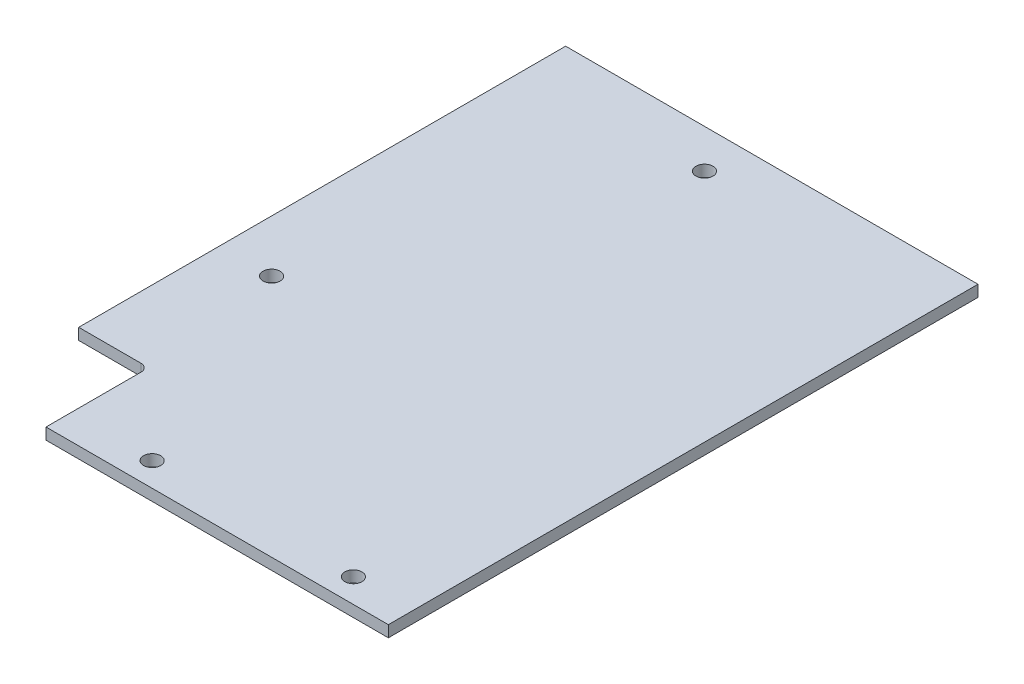
ISO-10303-21;
HEADER;
FILE_DESCRIPTION(('STEP AP214'),'2;1');
FILE_NAME('part.step','',(''),(''),'','','');
FILE_SCHEMA(('AUTOMOTIVE_DESIGN { 1 0 10303 214 1 1 1 1 }'));
ENDSEC;
DATA;
#1=APPLICATION_CONTEXT('core data for automotive mechanical design processes');
#2=APPLICATION_PROTOCOL_DEFINITION('international standard','automotive_design',2000,#1);
#3=PRODUCT_CONTEXT('',#1,'mechanical');
#4=PRODUCT('Part','Part','',(#3));
#5=PRODUCT_RELATED_PRODUCT_CATEGORY('part','',(#4));
#6=PRODUCT_DEFINITION_FORMATION('','',#4);
#7=PRODUCT_DEFINITION_CONTEXT('part definition',#1,'design');
#8=PRODUCT_DEFINITION('design','',#6,#7);
#9=PRODUCT_DEFINITION_SHAPE('','',#8);
#10=(LENGTH_UNIT() NAMED_UNIT(*) SI_UNIT(.MILLI.,.METRE.));
#11=(NAMED_UNIT(*) PLANE_ANGLE_UNIT() SI_UNIT($,.RADIAN.));
#12=(NAMED_UNIT(*) SI_UNIT($,.STERADIAN.) SOLID_ANGLE_UNIT());
#13=UNCERTAINTY_MEASURE_WITH_UNIT(LENGTH_MEASURE(1.E-05),#10,'distance_accuracy_value','');
#14=(GEOMETRIC_REPRESENTATION_CONTEXT(3) GLOBAL_UNCERTAINTY_ASSIGNED_CONTEXT((#13)) GLOBAL_UNIT_ASSIGNED_CONTEXT((#10,
#11,#12)) REPRESENTATION_CONTEXT('',''));
#15=CARTESIAN_POINT('',(0.,0.,0.));
#16=DIRECTION('',(0.,0.,1.));
#17=DIRECTION('',(1.,0.,0.));
#18=AXIS2_PLACEMENT_3D('',#15,#16,#17);
#19=CARTESIAN_POINT('',(-108.4,3.,0.));
#20=DIRECTION('',(0.,0.,1.));
#21=DIRECTION('',(1.,0.,0.));
#22=AXIS2_PLACEMENT_3D('',#19,#20,#21);
#23=PLANE('',#22);
#24=DIRECTION('',(-1.,0.,0.));
#25=VECTOR('',#24,1.);
#26=CARTESIAN_POINT('',(-108.4,0.,0.));
#27=LINE('',#26,#25);
#28=CARTESIAN_POINT('',(0.,0.,0.));
#29=VERTEX_POINT('',#28);
#30=CARTESIAN_POINT('',(-108.4,0.,0.));
#31=VERTEX_POINT('',#30);
#32=EDGE_CURVE('E123',#29,#31,#27,.T.);
#33=ORIENTED_EDGE('',*,*,#32,.T.);
#34=DIRECTION('',(0.,-1.,0.));
#35=VECTOR('',#34,1.);
#36=CARTESIAN_POINT('',(-108.4,3.,0.));
#37=LINE('',#36,#35);
#38=CARTESIAN_POINT('',(-108.4,3.,0.));
#39=VERTEX_POINT('',#38);
#40=EDGE_CURVE('E103',#39,#31,#37,.T.);
#41=ORIENTED_EDGE('',*,*,#40,.F.);
#42=DIRECTION('',(-1.,0.,0.));
#43=VECTOR('',#42,1.);
#44=CARTESIAN_POINT('',(-108.4,3.,0.));
#45=LINE('',#44,#43);
#46=CARTESIAN_POINT('',(0.,3.,0.));
#47=VERTEX_POINT('',#46);
#48=EDGE_CURVE('E110',#47,#39,#45,.T.);
#49=ORIENTED_EDGE('',*,*,#48,.F.);
#50=DIRECTION('',(0.,-1.,0.));
#51=VECTOR('',#50,1.);
#52=CARTESIAN_POINT('',(0.,3.,0.));
#53=LINE('',#52,#51);
#54=EDGE_CURVE('E144',#47,#29,#53,.T.);
#55=ORIENTED_EDGE('',*,*,#54,.T.);
#56=EDGE_LOOP('',(#33,#41,#49,#55));
#57=FACE_BOUND('',#56,.T.);
#58=ADVANCED_FACE('F39',(#57),#23,.F.);
#59=CARTESIAN_POINT('',(-108.4,3.,128.));
#60=DIRECTION('',(1.,0.,0.));
#61=DIRECTION('',(0.,0.,-1.));
#62=AXIS2_PLACEMENT_3D('',#59,#60,#61);
#63=PLANE('',#62);
#64=DIRECTION('',(0.,0.,1.));
#65=VECTOR('',#64,1.);
#66=CARTESIAN_POINT('',(-108.4,0.,128.));
#67=LINE('',#66,#65);
#68=CARTESIAN_POINT('',(-108.4,0.,128.));
#69=VERTEX_POINT('',#68);
#70=EDGE_CURVE('E158',#31,#69,#67,.T.);
#71=ORIENTED_EDGE('',*,*,#70,.T.);
#72=DIRECTION('',(0.,-1.,0.));
#73=VECTOR('',#72,1.);
#74=CARTESIAN_POINT('',(-108.4,3.,128.));
#75=LINE('',#74,#73);
#76=CARTESIAN_POINT('',(-108.4,3.,128.));
#77=VERTEX_POINT('',#76);
#78=EDGE_CURVE('E106',#77,#69,#75,.T.);
#79=ORIENTED_EDGE('',*,*,#78,.F.);
#80=DIRECTION('',(0.,0.,1.));
#81=VECTOR('',#80,1.);
#82=CARTESIAN_POINT('',(-108.4,3.,128.));
#83=LINE('',#82,#81);
#84=EDGE_CURVE('E99',#39,#77,#83,.T.);
#85=ORIENTED_EDGE('',*,*,#84,.F.);
#86=ORIENTED_EDGE('',*,*,#40,.T.);
#87=EDGE_LOOP('',(#71,#79,#85,#86));
#88=FACE_BOUND('',#87,.T.);
#89=ADVANCED_FACE('F101',(#88),#63,.F.);
#90=CARTESIAN_POINT('',(-90.,3.,128.));
#91=DIRECTION('',(0.,0.,-1.));
#92=DIRECTION('',(-1.,0.,0.));
#93=AXIS2_PLACEMENT_3D('',#90,#91,#92);
#94=PLANE('',#93);
#95=DIRECTION('',(1.,0.,0.));
#96=VECTOR('',#95,1.);
#97=CARTESIAN_POINT('',(-90.,0.,128.));
#98=LINE('',#97,#96);
#99=CARTESIAN_POINT('',(-92.,0.,128.));
#100=VERTEX_POINT('',#99);
#101=EDGE_CURVE('E155',#69,#100,#98,.T.);
#102=ORIENTED_EDGE('',*,*,#101,.T.);
#103=DIRECTION('',(0.,-1.,0.));
#104=VECTOR('',#103,1.);
#105=CARTESIAN_POINT('',(-92.,3.,128.));
#106=LINE('',#105,#104);
#107=CARTESIAN_POINT('',(-92.,3.,128.));
#108=VERTEX_POINT('',#107);
#109=EDGE_CURVE('E55',#100,#108,#106,.F.);
#110=ORIENTED_EDGE('',*,*,#109,.T.);
#111=DIRECTION('',(1.,0.,0.));
#112=VECTOR('',#111,1.);
#113=CARTESIAN_POINT('',(-90.,3.,128.));
#114=LINE('',#113,#112);
#115=EDGE_CURVE('E109',#77,#108,#114,.T.);
#116=ORIENTED_EDGE('',*,*,#115,.F.);
#117=ORIENTED_EDGE('',*,*,#78,.T.);
#118=EDGE_LOOP('',(#102,#110,#116,#117));
#119=FACE_BOUND('',#118,.T.);
#120=ADVANCED_FACE('F238',(#119),#94,.F.);
#121=CARTESIAN_POINT('',(-90.,3.,155.));
#122=DIRECTION('',(1.,0.,0.));
#123=DIRECTION('',(0.,0.,-1.));
#124=AXIS2_PLACEMENT_3D('',#121,#122,#123);
#125=PLANE('',#124);
#126=DIRECTION('',(0.,0.,1.));
#127=VECTOR('',#126,1.);
#128=CARTESIAN_POINT('',(-90.,3.,155.));
#129=LINE('',#128,#127);
#130=CARTESIAN_POINT('',(-90.,3.,130.));
#131=VERTEX_POINT('',#130);
#132=CARTESIAN_POINT('',(-90.,3.,155.));
#133=VERTEX_POINT('',#132);
#134=EDGE_CURVE('E169',#131,#133,#129,.T.);
#135=ORIENTED_EDGE('',*,*,#134,.F.);
#136=DIRECTION('',(0.,-1.,0.));
#137=VECTOR('',#136,1.);
#138=CARTESIAN_POINT('',(-90.,0.,130.));
#139=LINE('',#138,#137);
#140=CARTESIAN_POINT('',(-90.,0.,130.));
#141=VERTEX_POINT('',#140);
#142=EDGE_CURVE('E125',#131,#141,#139,.T.);
#143=ORIENTED_EDGE('',*,*,#142,.T.);
#144=DIRECTION('',(0.,0.,1.));
#145=VECTOR('',#144,1.);
#146=CARTESIAN_POINT('',(-90.,0.,155.));
#147=LINE('',#146,#145);
#148=CARTESIAN_POINT('',(-90.,0.,155.));
#149=VERTEX_POINT('',#148);
#150=EDGE_CURVE('E152',#141,#149,#147,.T.);
#151=ORIENTED_EDGE('',*,*,#150,.T.);
#152=DIRECTION('',(0.,-1.,0.));
#153=VECTOR('',#152,1.);
#154=CARTESIAN_POINT('',(-90.,3.,155.));
#155=LINE('',#154,#153);
#156=EDGE_CURVE('E131',#133,#149,#155,.T.);
#157=ORIENTED_EDGE('',*,*,#156,.F.);
#158=EDGE_LOOP('',(#135,#143,#151,#157));
#159=FACE_BOUND('',#158,.T.);
#160=ADVANCED_FACE('F243',(#159),#125,.F.);
#161=CARTESIAN_POINT('',(0.,3.,155.));
#162=DIRECTION('',(0.,0.,-1.));
#163=DIRECTION('',(-1.,0.,0.));
#164=AXIS2_PLACEMENT_3D('',#161,#162,#163);
#165=PLANE('',#164);
#166=DIRECTION('',(1.,0.,0.));
#167=VECTOR('',#166,1.);
#168=CARTESIAN_POINT('',(0.,0.,155.));
#169=LINE('',#168,#167);
#170=CARTESIAN_POINT('',(0.,0.,155.));
#171=VERTEX_POINT('',#170);
#172=EDGE_CURVE('E149',#149,#171,#169,.T.);
#173=ORIENTED_EDGE('',*,*,#172,.T.);
#174=DIRECTION('',(0.,-1.,0.));
#175=VECTOR('',#174,1.);
#176=CARTESIAN_POINT('',(0.,3.,155.));
#177=LINE('',#176,#175);
#178=CARTESIAN_POINT('',(0.,3.,155.));
#179=VERTEX_POINT('',#178);
#180=EDGE_CURVE('E140',#179,#171,#177,.T.);
#181=ORIENTED_EDGE('',*,*,#180,.F.);
#182=DIRECTION('',(1.,0.,0.));
#183=VECTOR('',#182,1.);
#184=CARTESIAN_POINT('',(0.,3.,155.));
#185=LINE('',#184,#183);
#186=EDGE_CURVE('E166',#133,#179,#185,.T.);
#187=ORIENTED_EDGE('',*,*,#186,.F.);
#188=ORIENTED_EDGE('',*,*,#156,.T.);
#189=EDGE_LOOP('',(#173,#181,#187,#188));
#190=FACE_BOUND('',#189,.T.);
#191=ADVANCED_FACE('F246',(#190),#165,.F.);
#192=CARTESIAN_POINT('',(0.,3.,0.));
#193=DIRECTION('',(-1.,0.,0.));
#194=DIRECTION('',(0.,0.,1.));
#195=AXIS2_PLACEMENT_3D('',#192,#193,#194);
#196=PLANE('',#195);
#197=DIRECTION('',(0.,0.,-1.));
#198=VECTOR('',#197,1.);
#199=CARTESIAN_POINT('',(0.,0.,0.));
#200=LINE('',#199,#198);
#201=EDGE_CURVE('E120',#171,#29,#200,.T.);
#202=ORIENTED_EDGE('',*,*,#201,.T.);
#203=ORIENTED_EDGE('',*,*,#54,.F.);
#204=DIRECTION('',(0.,0.,-1.));
#205=VECTOR('',#204,1.);
#206=CARTESIAN_POINT('',(0.,3.,0.));
#207=LINE('',#206,#205);
#208=EDGE_CURVE('E115',#179,#47,#207,.T.);
#209=ORIENTED_EDGE('',*,*,#208,.F.);
#210=ORIENTED_EDGE('',*,*,#180,.T.);
#211=EDGE_LOOP('',(#202,#203,#209,#210));
#212=FACE_BOUND('',#211,.T.);
#213=ADVANCED_FACE('F219',(#212),#196,.F.);
#214=CARTESIAN_POINT('',(0.,3.,0.));
#215=DIRECTION('',(0.,-1.,0.));
#216=DIRECTION('',(0.,0.,-1.));
#217=AXIS2_PLACEMENT_3D('',#214,#215,#216);
#218=PLANE('',#217);
#219=CARTESIAN_POINT('',(-61.7,3.,10.2));
#220=DIRECTION('',(0.,1.,0.));
#221=DIRECTION('',(0.,0.,1.));
#222=AXIS2_PLACEMENT_3D('',#219,#220,#221);
#223=CIRCLE('',#222,2.25);
#224=CARTESIAN_POINT('',(-61.7,3.,12.45));
#225=VERTEX_POINT('',#224);
#226=EDGE_CURVE('E182',#225,#225,#223,.T.);
#227=ORIENTED_EDGE('',*,*,#226,.F.);
#228=EDGE_LOOP('',(#227));
#229=FACE_BOUND('',#228,.T.);
#230=CARTESIAN_POINT('',(-94.7,3.,91.));
#231=DIRECTION('',(0.,1.,0.));
#232=DIRECTION('',(0.,0.,1.));
#233=AXIS2_PLACEMENT_3D('',#230,#231,#232);
#234=CIRCLE('',#233,2.25);
#235=CARTESIAN_POINT('',(-94.7,3.,93.25));
#236=VERTEX_POINT('',#235);
#237=EDGE_CURVE('E190',#236,#236,#234,.T.);
#238=ORIENTED_EDGE('',*,*,#237,.F.);
#239=EDGE_LOOP('',(#238));
#240=FACE_BOUND('',#239,.T.);
#241=CARTESIAN_POINT('',(-15.5,3.,148.7));
#242=DIRECTION('',(0.,1.,0.));
#243=DIRECTION('',(0.,0.,1.));
#244=AXIS2_PLACEMENT_3D('',#241,#242,#243);
#245=CIRCLE('',#244,2.25);
#246=CARTESIAN_POINT('',(-15.5,3.,150.95));
#247=VERTEX_POINT('',#246);
#248=EDGE_CURVE('E198',#247,#247,#245,.T.);
#249=ORIENTED_EDGE('',*,*,#248,.F.);
#250=EDGE_LOOP('',(#249));
#251=FACE_BOUND('',#250,.T.);
#252=CARTESIAN_POINT('',(-68.4,3.,148.7));
#253=DIRECTION('',(0.,1.,0.));
#254=DIRECTION('',(0.,0.,1.));
#255=AXIS2_PLACEMENT_3D('',#252,#253,#254);
#256=CIRCLE('',#255,2.25);
#257=CARTESIAN_POINT('',(-68.4,3.,150.95));
#258=VERTEX_POINT('',#257);
#259=EDGE_CURVE('E174',#258,#258,#256,.T.);
#260=ORIENTED_EDGE('',*,*,#259,.F.);
#261=EDGE_LOOP('',(#260));
#262=FACE_BOUND('',#261,.T.);
#263=ORIENTED_EDGE('',*,*,#48,.T.);
#264=ORIENTED_EDGE('',*,*,#84,.T.);
#265=ORIENTED_EDGE('',*,*,#115,.T.);
#266=CARTESIAN_POINT('',(-92.,3.,130.));
#267=DIRECTION('',(0.,-1.,0.));
#268=DIRECTION('',(0.,0.,-1.));
#269=AXIS2_PLACEMENT_3D('',#266,#267,#268);
#270=CIRCLE('',#269,2.);
#271=EDGE_CURVE('E11',#108,#131,#270,.T.);
#272=ORIENTED_EDGE('',*,*,#271,.T.);
#273=ORIENTED_EDGE('',*,*,#134,.T.);
#274=ORIENTED_EDGE('',*,*,#186,.T.);
#275=ORIENTED_EDGE('',*,*,#208,.T.);
#276=EDGE_LOOP('',(#263,#264,#265,#272,#273,#274,#275));
#277=FACE_BOUND('',#276,.T.);
#278=ADVANCED_FACE('F113',(#229,#240,#251,#262,#277),#218,.F.);
#279=CARTESIAN_POINT('',(0.,0.,0.));
#280=DIRECTION('',(0.,-1.,0.));
#281=DIRECTION('',(0.,0.,-1.));
#282=AXIS2_PLACEMENT_3D('',#279,#280,#281);
#283=PLANE('',#282);
#284=CARTESIAN_POINT('',(-61.7,0.,10.2));
#285=DIRECTION('',(0.,1.,0.));
#286=DIRECTION('',(0.,0.,1.));
#287=AXIS2_PLACEMENT_3D('',#284,#285,#286);
#288=CIRCLE('',#287,2.25);
#289=CARTESIAN_POINT('',(-61.7,0.,12.45));
#290=VERTEX_POINT('',#289);
#291=EDGE_CURVE('E186',#290,#290,#288,.T.);
#292=ORIENTED_EDGE('',*,*,#291,.T.);
#293=EDGE_LOOP('',(#292));
#294=FACE_BOUND('',#293,.T.);
#295=CARTESIAN_POINT('',(-94.7,0.,91.));
#296=DIRECTION('',(0.,1.,0.));
#297=DIRECTION('',(0.,0.,1.));
#298=AXIS2_PLACEMENT_3D('',#295,#296,#297);
#299=CIRCLE('',#298,2.25);
#300=CARTESIAN_POINT('',(-94.7,0.,93.25));
#301=VERTEX_POINT('',#300);
#302=EDGE_CURVE('E194',#301,#301,#299,.T.);
#303=ORIENTED_EDGE('',*,*,#302,.T.);
#304=EDGE_LOOP('',(#303));
#305=FACE_BOUND('',#304,.T.);
#306=CARTESIAN_POINT('',(-15.5,0.,148.7));
#307=DIRECTION('',(0.,1.,0.));
#308=DIRECTION('',(0.,0.,1.));
#309=AXIS2_PLACEMENT_3D('',#306,#307,#308);
#310=CIRCLE('',#309,2.25);
#311=CARTESIAN_POINT('',(-15.5,0.,150.95));
#312=VERTEX_POINT('',#311);
#313=EDGE_CURVE('E178',#312,#312,#310,.T.);
#314=ORIENTED_EDGE('',*,*,#313,.T.);
#315=EDGE_LOOP('',(#314));
#316=FACE_BOUND('',#315,.T.);
#317=CARTESIAN_POINT('',(-68.4,0.,148.7));
#318=DIRECTION('',(0.,1.,0.));
#319=DIRECTION('',(0.,0.,1.));
#320=AXIS2_PLACEMENT_3D('',#317,#318,#319);
#321=CIRCLE('',#320,2.25);
#322=CARTESIAN_POINT('',(-68.4,0.,150.95));
#323=VERTEX_POINT('',#322);
#324=EDGE_CURVE('E163',#323,#323,#321,.T.);
#325=ORIENTED_EDGE('',*,*,#324,.T.);
#326=EDGE_LOOP('',(#325));
#327=FACE_BOUND('',#326,.T.);
#328=ORIENTED_EDGE('',*,*,#32,.F.);
#329=ORIENTED_EDGE('',*,*,#201,.F.);
#330=ORIENTED_EDGE('',*,*,#172,.F.);
#331=ORIENTED_EDGE('',*,*,#150,.F.);
#332=CARTESIAN_POINT('',(-92.,0.,130.));
#333=DIRECTION('',(0.,-1.,0.));
#334=DIRECTION('',(0.,0.,-1.));
#335=AXIS2_PLACEMENT_3D('',#332,#333,#334);
#336=CIRCLE('',#335,2.);
#337=EDGE_CURVE('E48',#141,#100,#336,.F.);
#338=ORIENTED_EDGE('',*,*,#337,.T.);
#339=ORIENTED_EDGE('',*,*,#101,.F.);
#340=ORIENTED_EDGE('',*,*,#70,.F.);
#341=EDGE_LOOP('',(#328,#329,#330,#331,#338,#339,#340));
#342=FACE_BOUND('',#341,.T.);
#343=ADVANCED_FACE('F206',(#294,#305,#316,#327,#342),#283,.T.);
#344=CARTESIAN_POINT('',(-68.4,0.,148.7));
#345=DIRECTION('',(0.,1.,0.));
#346=DIRECTION('',(0.,0.,1.));
#347=AXIS2_PLACEMENT_3D('',#344,#345,#346);
#348=CYLINDRICAL_SURFACE('',#347,2.25);
#349=ORIENTED_EDGE('',*,*,#324,.F.);
#350=EDGE_LOOP('',(#349));
#351=FACE_BOUND('',#350,.T.);
#352=ORIENTED_EDGE('',*,*,#259,.T.);
#353=EDGE_LOOP('',(#352));
#354=FACE_BOUND('',#353,.T.);
#355=ADVANCED_FACE('F213',(#351,#354),#348,.F.);
#356=CARTESIAN_POINT('',(-15.5,0.,148.7));
#357=DIRECTION('',(0.,1.,0.));
#358=DIRECTION('',(0.,0.,1.));
#359=AXIS2_PLACEMENT_3D('',#356,#357,#358);
#360=CYLINDRICAL_SURFACE('',#359,2.25);
#361=ORIENTED_EDGE('',*,*,#313,.F.);
#362=EDGE_LOOP('',(#361));
#363=FACE_BOUND('',#362,.T.);
#364=ORIENTED_EDGE('',*,*,#248,.T.);
#365=EDGE_LOOP('',(#364));
#366=FACE_BOUND('',#365,.T.);
#367=ADVANCED_FACE('F209',(#363,#366),#360,.F.);
#368=CARTESIAN_POINT('',(-94.7,0.,91.));
#369=DIRECTION('',(0.,1.,0.));
#370=DIRECTION('',(0.,0.,1.));
#371=AXIS2_PLACEMENT_3D('',#368,#369,#370);
#372=CYLINDRICAL_SURFACE('',#371,2.25);
#373=ORIENTED_EDGE('',*,*,#302,.F.);
#374=EDGE_LOOP('',(#373));
#375=FACE_BOUND('',#374,.T.);
#376=ORIENTED_EDGE('',*,*,#237,.T.);
#377=EDGE_LOOP('',(#376));
#378=FACE_BOUND('',#377,.T.);
#379=ADVANCED_FACE('F212',(#375,#378),#372,.F.);
#380=CARTESIAN_POINT('',(-61.7,0.,10.2));
#381=DIRECTION('',(0.,1.,0.));
#382=DIRECTION('',(0.,0.,1.));
#383=AXIS2_PLACEMENT_3D('',#380,#381,#382);
#384=CYLINDRICAL_SURFACE('',#383,2.25);
#385=ORIENTED_EDGE('',*,*,#291,.F.);
#386=EDGE_LOOP('',(#385));
#387=FACE_BOUND('',#386,.T.);
#388=ORIENTED_EDGE('',*,*,#226,.T.);
#389=EDGE_LOOP('',(#388));
#390=FACE_BOUND('',#389,.T.);
#391=ADVANCED_FACE('F265',(#387,#390),#384,.F.);
#392=CARTESIAN_POINT('',(-92.,3.,130.));
#393=DIRECTION('',(0.,1.,0.));
#394=DIRECTION('',(0.,0.,1.));
#395=AXIS2_PLACEMENT_3D('',#392,#393,#394);
#396=CYLINDRICAL_SURFACE('',#395,2.);
#397=ORIENTED_EDGE('',*,*,#271,.F.);
#398=ORIENTED_EDGE('',*,*,#109,.F.);
#399=ORIENTED_EDGE('',*,*,#337,.F.);
#400=ORIENTED_EDGE('',*,*,#142,.F.);
#401=EDGE_LOOP('',(#397,#398,#399,#400));
#402=FACE_BOUND('',#401,.T.);
#403=ADVANCED_FACE('F41',(#402),#396,.F.);
#404=CLOSED_SHELL('',(#58,#89,#120,#160,#191,#213,#278,#343,#355,#367,#379,#391,#403));
#405=MANIFOLD_SOLID_BREP('B2',#404);
#406=ADVANCED_BREP_SHAPE_REPRESENTATION('',(#18,#405),#14);
#407=SHAPE_DEFINITION_REPRESENTATION(#9,#406);
ENDSEC;
END-ISO-10303-21;
